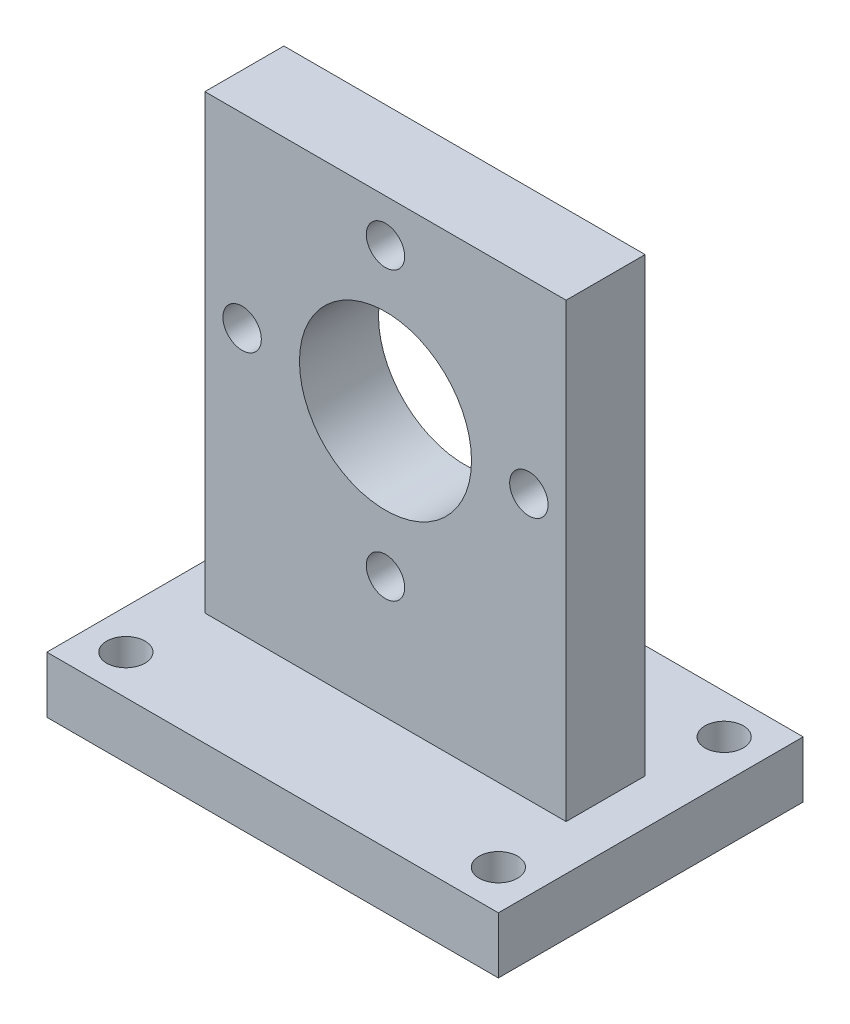
ISO-10303-21;
HEADER;
FILE_DESCRIPTION(('STEP AP214'),'2;1');
FILE_NAME('part.step','',(''),(''),'','','');
FILE_SCHEMA(('AUTOMOTIVE_DESIGN { 1 0 10303 214 1 1 1 1 }'));
ENDSEC;
DATA;
#1=APPLICATION_CONTEXT('core data for automotive mechanical design processes');
#2=APPLICATION_PROTOCOL_DEFINITION('international standard','automotive_design',2000,#1);
#3=PRODUCT_CONTEXT('',#1,'mechanical');
#4=PRODUCT('Part','Part','',(#3));
#5=PRODUCT_RELATED_PRODUCT_CATEGORY('part','',(#4));
#6=PRODUCT_DEFINITION_FORMATION('','',#4);
#7=PRODUCT_DEFINITION_CONTEXT('part definition',#1,'design');
#8=PRODUCT_DEFINITION('design','',#6,#7);
#9=PRODUCT_DEFINITION_SHAPE('','',#8);
#10=(LENGTH_UNIT() NAMED_UNIT(*) SI_UNIT(.MILLI.,.METRE.));
#11=(NAMED_UNIT(*) PLANE_ANGLE_UNIT() SI_UNIT($,.RADIAN.));
#12=(NAMED_UNIT(*) SI_UNIT($,.STERADIAN.) SOLID_ANGLE_UNIT());
#13=UNCERTAINTY_MEASURE_WITH_UNIT(LENGTH_MEASURE(1.E-05),#10,'distance_accuracy_value','');
#14=(GEOMETRIC_REPRESENTATION_CONTEXT(3) GLOBAL_UNCERTAINTY_ASSIGNED_CONTEXT((#13)) GLOBAL_UNIT_ASSIGNED_CONTEXT((#10,
#11,#12)) REPRESENTATION_CONTEXT('',''));
#15=CARTESIAN_POINT('',(0.,0.,0.));
#16=DIRECTION('',(0.,0.,1.));
#17=DIRECTION('',(1.,0.,0.));
#18=AXIS2_PLACEMENT_3D('',#15,#16,#17);
#19=CARTESIAN_POINT('',(-20.,5.,13.5));
#20=DIRECTION('',(0.,0.,-1.));
#21=DIRECTION('',(-1.,0.,0.));
#22=AXIS2_PLACEMENT_3D('',#19,#20,#21);
#23=PLANE('',#22);
#24=DIRECTION('',(1.,0.,0.));
#25=VECTOR('',#24,1.);
#26=CARTESIAN_POINT('',(-20.,0.,13.5));
#27=LINE('',#26,#25);
#28=CARTESIAN_POINT('',(-20.,0.,13.5));
#29=VERTEX_POINT('',#28);
#30=CARTESIAN_POINT('',(20.,0.,13.5));
#31=VERTEX_POINT('',#30);
#32=EDGE_CURVE('E175',#29,#31,#27,.T.);
#33=ORIENTED_EDGE('',*,*,#32,.T.);
#34=DIRECTION('',(0.,-1.,0.));
#35=VECTOR('',#34,1.);
#36=CARTESIAN_POINT('',(20.,5.,13.5));
#37=LINE('',#36,#35);
#38=CARTESIAN_POINT('',(20.,5.,13.5));
#39=VERTEX_POINT('',#38);
#40=EDGE_CURVE('E12',#39,#31,#37,.T.);
#41=ORIENTED_EDGE('',*,*,#40,.F.);
#42=DIRECTION('',(1.,0.,0.));
#43=VECTOR('',#42,1.);
#44=CARTESIAN_POINT('',(-20.,5.,13.5));
#45=LINE('',#44,#43);
#46=CARTESIAN_POINT('',(-20.,5.,13.5));
#47=VERTEX_POINT('',#46);
#48=EDGE_CURVE('E109',#47,#39,#45,.T.);
#49=ORIENTED_EDGE('',*,*,#48,.F.);
#50=DIRECTION('',(0.,-1.,0.));
#51=VECTOR('',#50,1.);
#52=CARTESIAN_POINT('',(-20.,5.,13.5));
#53=LINE('',#52,#51);
#54=EDGE_CURVE('E184',#47,#29,#53,.T.);
#55=ORIENTED_EDGE('',*,*,#54,.T.);
#56=EDGE_LOOP('',(#33,#41,#49,#55));
#57=FACE_BOUND('',#56,.T.);
#58=ADVANCED_FACE('F61',(#57),#23,.F.);
#59=CARTESIAN_POINT('',(20.,5.,-13.5));
#60=DIRECTION('',(1.,0.,0.));
#61=DIRECTION('',(0.,0.,-1.));
#62=AXIS2_PLACEMENT_3D('',#59,#60,#61);
#63=PLANE('',#62);
#64=DIRECTION('',(0.,0.,1.));
#65=VECTOR('',#64,1.);
#66=CARTESIAN_POINT('',(20.,0.,-13.5));
#67=LINE('',#66,#65);
#68=CARTESIAN_POINT('',(20.,0.,-13.5));
#69=VERTEX_POINT('',#68);
#70=EDGE_CURVE('E187',#69,#31,#67,.T.);
#71=ORIENTED_EDGE('',*,*,#70,.F.);
#72=DIRECTION('',(0.,-1.,0.));
#73=VECTOR('',#72,1.);
#74=CARTESIAN_POINT('',(20.,5.,-13.5));
#75=LINE('',#74,#73);
#76=CARTESIAN_POINT('',(20.,5.,-13.5));
#77=VERTEX_POINT('',#76);
#78=EDGE_CURVE('E68',#77,#69,#75,.T.);
#79=ORIENTED_EDGE('',*,*,#78,.F.);
#80=DIRECTION('',(0.,0.,1.));
#81=VECTOR('',#80,1.);
#82=CARTESIAN_POINT('',(20.,5.,-13.5));
#83=LINE('',#82,#81);
#84=EDGE_CURVE('E177',#77,#39,#83,.T.);
#85=ORIENTED_EDGE('',*,*,#84,.T.);
#86=ORIENTED_EDGE('',*,*,#40,.T.);
#87=EDGE_LOOP('',(#71,#79,#85,#86));
#88=FACE_BOUND('',#87,.T.);
#89=ADVANCED_FACE('F201',(#88),#63,.T.);
#90=CARTESIAN_POINT('',(-20.,5.,-13.5));
#91=DIRECTION('',(0.,0.,-1.));
#92=DIRECTION('',(-1.,0.,0.));
#93=AXIS2_PLACEMENT_3D('',#90,#91,#92);
#94=PLANE('',#93);
#95=DIRECTION('',(1.,0.,0.));
#96=VECTOR('',#95,1.);
#97=CARTESIAN_POINT('',(-20.,0.,-13.5));
#98=LINE('',#97,#96);
#99=CARTESIAN_POINT('',(-20.,0.,-13.5));
#100=VERTEX_POINT('',#99);
#101=EDGE_CURVE('E190',#100,#69,#98,.T.);
#102=ORIENTED_EDGE('',*,*,#101,.F.);
#103=DIRECTION('',(0.,-1.,0.));
#104=VECTOR('',#103,1.);
#105=CARTESIAN_POINT('',(-20.,5.,-13.5));
#106=LINE('',#105,#104);
#107=CARTESIAN_POINT('',(-20.,5.,-13.5));
#108=VERTEX_POINT('',#107);
#109=EDGE_CURVE('E195',#108,#100,#106,.T.);
#110=ORIENTED_EDGE('',*,*,#109,.F.);
#111=DIRECTION('',(1.,0.,0.));
#112=VECTOR('',#111,1.);
#113=CARTESIAN_POINT('',(-20.,5.,-13.5));
#114=LINE('',#113,#112);
#115=EDGE_CURVE('E180',#108,#77,#114,.T.);
#116=ORIENTED_EDGE('',*,*,#115,.T.);
#117=ORIENTED_EDGE('',*,*,#78,.T.);
#118=EDGE_LOOP('',(#102,#110,#116,#117));
#119=FACE_BOUND('',#118,.T.);
#120=ADVANCED_FACE('F199',(#119),#94,.T.);
#121=CARTESIAN_POINT('',(-20.,5.,-13.5));
#122=DIRECTION('',(1.,0.,0.));
#123=DIRECTION('',(0.,0.,-1.));
#124=AXIS2_PLACEMENT_3D('',#121,#122,#123);
#125=PLANE('',#124);
#126=DIRECTION('',(0.,0.,1.));
#127=VECTOR('',#126,1.);
#128=CARTESIAN_POINT('',(-20.,0.,-13.5));
#129=LINE('',#128,#127);
#130=EDGE_CURVE('E104',#100,#29,#129,.T.);
#131=ORIENTED_EDGE('',*,*,#130,.T.);
#132=ORIENTED_EDGE('',*,*,#54,.F.);
#133=DIRECTION('',(0.,0.,1.));
#134=VECTOR('',#133,1.);
#135=CARTESIAN_POINT('',(-20.,5.,-13.5));
#136=LINE('',#135,#134);
#137=EDGE_CURVE('E84',#108,#47,#136,.T.);
#138=ORIENTED_EDGE('',*,*,#137,.F.);
#139=ORIENTED_EDGE('',*,*,#109,.T.);
#140=EDGE_LOOP('',(#131,#132,#138,#139));
#141=FACE_BOUND('',#140,.T.);
#142=ADVANCED_FACE('F206',(#141),#125,.F.);
#143=CARTESIAN_POINT('',(0.,5.,0.));
#144=DIRECTION('',(0.,-1.,0.));
#145=DIRECTION('',(0.,0.,-1.));
#146=AXIS2_PLACEMENT_3D('',#143,#144,#145);
#147=PLANE('',#146);
#148=CARTESIAN_POINT('',(16.5,5.,-10.));
#149=DIRECTION('',(0.,1.,0.));
#150=DIRECTION('',(0.,0.,-1.));
#151=AXIS2_PLACEMENT_3D('',#148,#149,#150);
#152=CIRCLE('',#151,1.7);
#153=CARTESIAN_POINT('',(16.5,5.,-11.7));
#154=VERTEX_POINT('',#153);
#155=EDGE_CURVE('E441',#154,#154,#152,.T.);
#156=ORIENTED_EDGE('',*,*,#155,.F.);
#157=EDGE_LOOP('',(#156));
#158=FACE_BOUND('',#157,.T.);
#159=CARTESIAN_POINT('',(16.5,5.,10.));
#160=DIRECTION('',(0.,1.,0.));
#161=DIRECTION('',(0.,0.,-1.));
#162=AXIS2_PLACEMENT_3D('',#159,#160,#161);
#163=CIRCLE('',#162,1.7);
#164=CARTESIAN_POINT('',(16.5,5.,8.3));
#165=VERTEX_POINT('',#164);
#166=EDGE_CURVE('E443',#165,#165,#163,.T.);
#167=ORIENTED_EDGE('',*,*,#166,.F.);
#168=EDGE_LOOP('',(#167));
#169=FACE_BOUND('',#168,.T.);
#170=CARTESIAN_POINT('',(-16.5,5.,10.));
#171=DIRECTION('',(0.,1.,0.));
#172=DIRECTION('',(0.,0.,1.));
#173=AXIS2_PLACEMENT_3D('',#170,#171,#172);
#174=CIRCLE('',#173,1.7);
#175=CARTESIAN_POINT('',(-16.5,5.,11.7));
#176=VERTEX_POINT('',#175);
#177=EDGE_CURVE('E509',#176,#176,#174,.T.);
#178=ORIENTED_EDGE('',*,*,#177,.F.);
#179=EDGE_LOOP('',(#178));
#180=FACE_BOUND('',#179,.T.);
#181=CARTESIAN_POINT('',(-16.5,5.,-9.99999999999999));
#182=DIRECTION('',(0.,1.,0.));
#183=DIRECTION('',(0.,0.,1.));
#184=AXIS2_PLACEMENT_3D('',#181,#182,#183);
#185=CIRCLE('',#184,1.7);
#186=CARTESIAN_POINT('',(-16.5,5.,-8.3));
#187=VERTEX_POINT('',#186);
#188=EDGE_CURVE('E447',#187,#187,#185,.T.);
#189=ORIENTED_EDGE('',*,*,#188,.F.);
#190=EDGE_LOOP('',(#189));
#191=FACE_BOUND('',#190,.T.);
#192=DIRECTION('',(1.,0.,0.));
#193=VECTOR('',#192,1.);
#194=CARTESIAN_POINT('',(0.,5.,-3.5));
#195=LINE('',#194,#193);
#196=CARTESIAN_POINT('',(-16.,5.,-3.5));
#197=VERTEX_POINT('',#196);
#198=CARTESIAN_POINT('',(16.,5.,-3.5));
#199=VERTEX_POINT('',#198);
#200=EDGE_CURVE('E170',#197,#199,#195,.T.);
#201=ORIENTED_EDGE('',*,*,#200,.T.);
#202=DIRECTION('',(0.,0.,1.));
#203=VECTOR('',#202,1.);
#204=CARTESIAN_POINT('',(16.,5.,0.));
#205=LINE('',#204,#203);
#206=CARTESIAN_POINT('',(16.,5.00000000000001,3.5));
#207=VERTEX_POINT('',#206);
#208=EDGE_CURVE('E139',#199,#207,#205,.T.);
#209=ORIENTED_EDGE('',*,*,#208,.T.);
#210=DIRECTION('',(1.,0.,0.));
#211=VECTOR('',#210,1.);
#212=CARTESIAN_POINT('',(0.,5.,3.5));
#213=LINE('',#212,#211);
#214=CARTESIAN_POINT('',(-16.,5.,3.5));
#215=VERTEX_POINT('',#214);
#216=EDGE_CURVE('E75',#215,#207,#213,.T.);
#217=ORIENTED_EDGE('',*,*,#216,.F.);
#218=DIRECTION('',(0.,0.,1.));
#219=VECTOR('',#218,1.);
#220=CARTESIAN_POINT('',(-16.,5.,0.));
#221=LINE('',#220,#219);
#222=EDGE_CURVE('E172',#197,#215,#221,.T.);
#223=ORIENTED_EDGE('',*,*,#222,.F.);
#224=EDGE_LOOP('',(#201,#209,#217,#223));
#225=FACE_BOUND('',#224,.T.);
#226=ORIENTED_EDGE('',*,*,#48,.T.);
#227=ORIENTED_EDGE('',*,*,#84,.F.);
#228=ORIENTED_EDGE('',*,*,#115,.F.);
#229=ORIENTED_EDGE('',*,*,#137,.T.);
#230=EDGE_LOOP('',(#226,#227,#228,#229));
#231=FACE_BOUND('',#230,.T.);
#232=ADVANCED_FACE('F207',(#158,#169,#180,#191,#225,#231),#147,.F.);
#233=CARTESIAN_POINT('',(0.,0.,0.));
#234=DIRECTION('',(0.,-1.,0.));
#235=DIRECTION('',(0.,0.,-1.));
#236=AXIS2_PLACEMENT_3D('',#233,#234,#235);
#237=PLANE('',#236);
#238=CARTESIAN_POINT('',(16.5,0.,-10.));
#239=DIRECTION('',(0.,-1.,0.));
#240=DIRECTION('',(0.,0.,-1.));
#241=AXIS2_PLACEMENT_3D('',#238,#239,#240);
#242=CIRCLE('',#241,1.7);
#243=CARTESIAN_POINT('',(16.5,0.,-11.7));
#244=VERTEX_POINT('',#243);
#245=EDGE_CURVE('E439',#244,#244,#242,.F.);
#246=ORIENTED_EDGE('',*,*,#245,.T.);
#247=EDGE_LOOP('',(#246));
#248=FACE_BOUND('',#247,.T.);
#249=CARTESIAN_POINT('',(16.5,0.,10.));
#250=DIRECTION('',(0.,-1.,0.));
#251=DIRECTION('',(0.,0.,-1.));
#252=AXIS2_PLACEMENT_3D('',#249,#250,#251);
#253=CIRCLE('',#252,1.7);
#254=CARTESIAN_POINT('',(16.5,0.,8.3));
#255=VERTEX_POINT('',#254);
#256=EDGE_CURVE('E514',#255,#255,#253,.F.);
#257=ORIENTED_EDGE('',*,*,#256,.T.);
#258=EDGE_LOOP('',(#257));
#259=FACE_BOUND('',#258,.T.);
#260=CARTESIAN_POINT('',(-16.5,0.,10.));
#261=DIRECTION('',(0.,-1.,0.));
#262=DIRECTION('',(0.,0.,-1.));
#263=AXIS2_PLACEMENT_3D('',#260,#261,#262);
#264=CIRCLE('',#263,1.7);
#265=CARTESIAN_POINT('',(-16.5,0.,8.30000000000001));
#266=VERTEX_POINT('',#265);
#267=EDGE_CURVE('E454',#266,#266,#264,.F.);
#268=ORIENTED_EDGE('',*,*,#267,.T.);
#269=EDGE_LOOP('',(#268));
#270=FACE_BOUND('',#269,.T.);
#271=CARTESIAN_POINT('',(-16.5,0.,-9.99999999999999));
#272=DIRECTION('',(0.,-1.,0.));
#273=DIRECTION('',(0.,0.,-1.));
#274=AXIS2_PLACEMENT_3D('',#271,#272,#273);
#275=CIRCLE('',#274,1.7);
#276=CARTESIAN_POINT('',(-16.5,0.,-11.7));
#277=VERTEX_POINT('',#276);
#278=EDGE_CURVE('E451',#277,#277,#275,.F.);
#279=ORIENTED_EDGE('',*,*,#278,.T.);
#280=EDGE_LOOP('',(#279));
#281=FACE_BOUND('',#280,.T.);
#282=ORIENTED_EDGE('',*,*,#32,.F.);
#283=ORIENTED_EDGE('',*,*,#130,.F.);
#284=ORIENTED_EDGE('',*,*,#101,.T.);
#285=ORIENTED_EDGE('',*,*,#70,.T.);
#286=EDGE_LOOP('',(#282,#283,#284,#285));
#287=FACE_BOUND('',#286,.T.);
#288=ADVANCED_FACE('F204',(#248,#259,#270,#281,#287),#237,.T.);
#289=CARTESIAN_POINT('',(0.,45.,-3.5));
#290=DIRECTION('',(0.,0.,-1.));
#291=DIRECTION('',(-1.,0.,0.));
#292=AXIS2_PLACEMENT_3D('',#289,#290,#291);
#293=PLANE('',#292);
#294=CARTESIAN_POINT('',(0.,41.2,-3.5));
#295=DIRECTION('',(0.,0.,-1.));
#296=DIRECTION('',(-1.,0.,0.));
#297=AXIS2_PLACEMENT_3D('',#294,#295,#296);
#298=CIRCLE('',#297,1.7);
#299=CARTESIAN_POINT('',(-1.7,41.2,-3.5));
#300=VERTEX_POINT('',#299);
#301=EDGE_CURVE('E459',#300,#300,#298,.F.);
#302=ORIENTED_EDGE('',*,*,#301,.T.);
#303=EDGE_LOOP('',(#302));
#304=FACE_BOUND('',#303,.T.);
#305=CARTESIAN_POINT('',(12.7000000000002,28.5000000000001,-3.5));
#306=DIRECTION('',(0.,0.,-1.));
#307=DIRECTION('',(-1.,0.,0.));
#308=AXIS2_PLACEMENT_3D('',#305,#306,#307);
#309=CIRCLE('',#308,1.7);
#310=CARTESIAN_POINT('',(11.0000000000002,28.5000000000001,-3.5));
#311=VERTEX_POINT('',#310);
#312=EDGE_CURVE('E462',#311,#311,#309,.F.);
#313=ORIENTED_EDGE('',*,*,#312,.T.);
#314=EDGE_LOOP('',(#313));
#315=FACE_BOUND('',#314,.T.);
#316=CARTESIAN_POINT('',(2.66516243803523E-13,15.8,-3.5));
#317=DIRECTION('',(0.,0.,-1.));
#318=DIRECTION('',(-1.,0.,0.));
#319=AXIS2_PLACEMENT_3D('',#316,#317,#318);
#320=CIRCLE('',#319,1.7);
#321=CARTESIAN_POINT('',(-1.69999999999973,15.8,-3.5));
#322=VERTEX_POINT('',#321);
#323=EDGE_CURVE('E468',#322,#322,#320,.F.);
#324=ORIENTED_EDGE('',*,*,#323,.T.);
#325=EDGE_LOOP('',(#324));
#326=FACE_BOUND('',#325,.T.);
#327=CARTESIAN_POINT('',(-12.6999999999998,28.5,-3.5));
#328=DIRECTION('',(0.,0.,-1.));
#329=DIRECTION('',(-1.,0.,0.));
#330=AXIS2_PLACEMENT_3D('',#327,#328,#329);
#331=CIRCLE('',#330,1.7);
#332=CARTESIAN_POINT('',(-14.3999999999998,28.5,-3.5));
#333=VERTEX_POINT('',#332);
#334=EDGE_CURVE('E474',#333,#333,#331,.F.);
#335=ORIENTED_EDGE('',*,*,#334,.T.);
#336=EDGE_LOOP('',(#335));
#337=FACE_BOUND('',#336,.T.);
#338=CARTESIAN_POINT('',(0.,28.5,-3.5));
#339=DIRECTION('',(0.,0.,-1.));
#340=DIRECTION('',(-1.,0.,0.));
#341=AXIS2_PLACEMENT_3D('',#338,#339,#340);
#342=CIRCLE('',#341,7.62);
#343=CARTESIAN_POINT('',(-7.62,28.5,-3.5));
#344=VERTEX_POINT('',#343);
#345=EDGE_CURVE('E458',#344,#344,#342,.F.);
#346=ORIENTED_EDGE('',*,*,#345,.T.);
#347=EDGE_LOOP('',(#346));
#348=FACE_BOUND('',#347,.T.);
#349=ORIENTED_EDGE('',*,*,#200,.F.);
#350=DIRECTION('',(0.,-1.,0.));
#351=VECTOR('',#350,1.);
#352=CARTESIAN_POINT('',(-16.,45.,-3.5));
#353=LINE('',#352,#351);
#354=CARTESIAN_POINT('',(-16.,45.,-3.5));
#355=VERTEX_POINT('',#354);
#356=EDGE_CURVE('E143',#355,#197,#353,.T.);
#357=ORIENTED_EDGE('',*,*,#356,.F.);
#358=DIRECTION('',(1.,0.,0.));
#359=VECTOR('',#358,1.);
#360=CARTESIAN_POINT('',(0.,45.,-3.5));
#361=LINE('',#360,#359);
#362=CARTESIAN_POINT('',(16.,45.,-3.5));
#363=VERTEX_POINT('',#362);
#364=EDGE_CURVE('E148',#355,#363,#361,.T.);
#365=ORIENTED_EDGE('',*,*,#364,.T.);
#366=DIRECTION('',(0.,-1.,0.));
#367=VECTOR('',#366,1.);
#368=CARTESIAN_POINT('',(16.,45.,-3.5));
#369=LINE('',#368,#367);
#370=EDGE_CURVE('E134',#363,#199,#369,.T.);
#371=ORIENTED_EDGE('',*,*,#370,.T.);
#372=EDGE_LOOP('',(#349,#357,#365,#371));
#373=FACE_BOUND('',#372,.T.);
#374=ADVANCED_FACE('F154',(#304,#315,#326,#337,#348,#373),#293,.T.);
#375=CARTESIAN_POINT('',(0.,45.,3.5));
#376=DIRECTION('',(0.,0.,-1.));
#377=DIRECTION('',(-1.,0.,0.));
#378=AXIS2_PLACEMENT_3D('',#375,#376,#377);
#379=PLANE('',#378);
#380=CARTESIAN_POINT('',(0.,41.2,3.5));
#381=DIRECTION('',(0.,0.,1.));
#382=DIRECTION('',(1.,0.,0.));
#383=AXIS2_PLACEMENT_3D('',#380,#381,#382);
#384=CIRCLE('',#383,1.7);
#385=CARTESIAN_POINT('',(1.7,41.2,3.5));
#386=VERTEX_POINT('',#385);
#387=EDGE_CURVE('E455',#386,#386,#384,.T.);
#388=ORIENTED_EDGE('',*,*,#387,.F.);
#389=EDGE_LOOP('',(#388));
#390=FACE_BOUND('',#389,.T.);
#391=CARTESIAN_POINT('',(12.7000000000002,28.5000000000001,3.5));
#392=DIRECTION('',(0.,0.,1.));
#393=DIRECTION('',(1.,0.,0.));
#394=AXIS2_PLACEMENT_3D('',#391,#392,#393);
#395=CIRCLE('',#394,1.7);
#396=CARTESIAN_POINT('',(14.4000000000002,28.5000000000001,3.5));
#397=VERTEX_POINT('',#396);
#398=EDGE_CURVE('E465',#397,#397,#395,.T.);
#399=ORIENTED_EDGE('',*,*,#398,.F.);
#400=EDGE_LOOP('',(#399));
#401=FACE_BOUND('',#400,.T.);
#402=CARTESIAN_POINT('',(2.66516243803523E-13,15.8,3.5));
#403=DIRECTION('',(0.,0.,1.));
#404=DIRECTION('',(1.,0.,0.));
#405=AXIS2_PLACEMENT_3D('',#402,#403,#404);
#406=CIRCLE('',#405,1.7);
#407=CARTESIAN_POINT('',(1.70000000000027,15.8,3.5));
#408=VERTEX_POINT('',#407);
#409=EDGE_CURVE('E471',#408,#408,#406,.T.);
#410=ORIENTED_EDGE('',*,*,#409,.F.);
#411=EDGE_LOOP('',(#410));
#412=FACE_BOUND('',#411,.T.);
#413=CARTESIAN_POINT('',(-12.6999999999998,28.5,3.5));
#414=DIRECTION('',(0.,0.,1.));
#415=DIRECTION('',(1.,0.,0.));
#416=AXIS2_PLACEMENT_3D('',#413,#414,#415);
#417=CIRCLE('',#416,1.7);
#418=CARTESIAN_POINT('',(-10.9999999999998,28.5,3.5));
#419=VERTEX_POINT('',#418);
#420=EDGE_CURVE('E450',#419,#419,#417,.T.);
#421=ORIENTED_EDGE('',*,*,#420,.F.);
#422=EDGE_LOOP('',(#421));
#423=FACE_BOUND('',#422,.T.);
#424=CARTESIAN_POINT('',(0.,28.5,3.5));
#425=DIRECTION('',(0.,0.,1.));
#426=DIRECTION('',(1.,0.,0.));
#427=AXIS2_PLACEMENT_3D('',#424,#425,#426);
#428=CIRCLE('',#427,7.62);
#429=CARTESIAN_POINT('',(7.62,28.5,3.5));
#430=VERTEX_POINT('',#429);
#431=EDGE_CURVE('E152',#430,#430,#428,.T.);
#432=ORIENTED_EDGE('',*,*,#431,.F.);
#433=EDGE_LOOP('',(#432));
#434=FACE_BOUND('',#433,.T.);
#435=DIRECTION('',(0.,-1.,0.));
#436=VECTOR('',#435,1.);
#437=CARTESIAN_POINT('',(-16.,45.,3.5));
#438=LINE('',#437,#436);
#439=CARTESIAN_POINT('',(-16.,45.,3.5));
#440=VERTEX_POINT('',#439);
#441=EDGE_CURVE('E165',#440,#215,#438,.T.);
#442=ORIENTED_EDGE('',*,*,#441,.T.);
#443=ORIENTED_EDGE('',*,*,#216,.T.);
#444=DIRECTION('',(0.,-1.,0.));
#445=VECTOR('',#444,1.);
#446=CARTESIAN_POINT('',(16.,45.,3.5));
#447=LINE('',#446,#445);
#448=CARTESIAN_POINT('',(16.,45.,3.5));
#449=VERTEX_POINT('',#448);
#450=EDGE_CURVE('E163',#449,#207,#447,.T.);
#451=ORIENTED_EDGE('',*,*,#450,.F.);
#452=DIRECTION('',(1.,0.,0.));
#453=VECTOR('',#452,1.);
#454=CARTESIAN_POINT('',(0.,45.,3.5));
#455=LINE('',#454,#453);
#456=EDGE_CURVE('E150',#440,#449,#455,.T.);
#457=ORIENTED_EDGE('',*,*,#456,.F.);
#458=EDGE_LOOP('',(#442,#443,#451,#457));
#459=FACE_BOUND('',#458,.T.);
#460=ADVANCED_FACE('F247',(#390,#401,#412,#423,#434,#459),#379,.F.);
#461=CARTESIAN_POINT('',(16.,45.,0.));
#462=DIRECTION('',(1.,0.,0.));
#463=DIRECTION('',(0.,0.,-1.));
#464=AXIS2_PLACEMENT_3D('',#461,#462,#463);
#465=PLANE('',#464);
#466=ORIENTED_EDGE('',*,*,#208,.F.);
#467=ORIENTED_EDGE('',*,*,#370,.F.);
#468=DIRECTION('',(0.,0.,1.));
#469=VECTOR('',#468,1.);
#470=CARTESIAN_POINT('',(16.,45.,0.));
#471=LINE('',#470,#469);
#472=EDGE_CURVE('E138',#363,#449,#471,.T.);
#473=ORIENTED_EDGE('',*,*,#472,.T.);
#474=ORIENTED_EDGE('',*,*,#450,.T.);
#475=EDGE_LOOP('',(#466,#467,#473,#474));
#476=FACE_BOUND('',#475,.T.);
#477=ADVANCED_FACE('F136',(#476),#465,.T.);
#478=CARTESIAN_POINT('',(-16.,45.,0.));
#479=DIRECTION('',(1.,0.,0.));
#480=DIRECTION('',(0.,0.,-1.));
#481=AXIS2_PLACEMENT_3D('',#478,#479,#480);
#482=PLANE('',#481);
#483=ORIENTED_EDGE('',*,*,#356,.T.);
#484=ORIENTED_EDGE('',*,*,#222,.T.);
#485=ORIENTED_EDGE('',*,*,#441,.F.);
#486=DIRECTION('',(0.,0.,1.));
#487=VECTOR('',#486,1.);
#488=CARTESIAN_POINT('',(-16.,45.,0.));
#489=LINE('',#488,#487);
#490=EDGE_CURVE('E157',#355,#440,#489,.T.);
#491=ORIENTED_EDGE('',*,*,#490,.F.);
#492=EDGE_LOOP('',(#483,#484,#485,#491));
#493=FACE_BOUND('',#492,.T.);
#494=ADVANCED_FACE('F246',(#493),#482,.F.);
#495=CARTESIAN_POINT('',(0.,45.,0.));
#496=DIRECTION('',(0.,1.,0.));
#497=DIRECTION('',(0.,0.,1.));
#498=AXIS2_PLACEMENT_3D('',#495,#496,#497);
#499=PLANE('',#498);
#500=ORIENTED_EDGE('',*,*,#472,.F.);
#501=ORIENTED_EDGE('',*,*,#364,.F.);
#502=ORIENTED_EDGE('',*,*,#490,.T.);
#503=ORIENTED_EDGE('',*,*,#456,.T.);
#504=EDGE_LOOP('',(#500,#501,#502,#503));
#505=FACE_BOUND('',#504,.T.);
#506=ADVANCED_FACE('F147',(#505),#499,.T.);
#507=CARTESIAN_POINT('',(0.,28.5,-13.501));
#508=DIRECTION('',(0.,0.,1.));
#509=DIRECTION('',(1.,0.,0.));
#510=AXIS2_PLACEMENT_3D('',#507,#508,#509);
#511=CYLINDRICAL_SURFACE('',#510,7.62);
#512=ORIENTED_EDGE('',*,*,#345,.F.);
#513=EDGE_LOOP('',(#512));
#514=FACE_BOUND('',#513,.T.);
#515=ORIENTED_EDGE('',*,*,#431,.T.);
#516=EDGE_LOOP('',(#515));
#517=FACE_BOUND('',#516,.T.);
#518=ADVANCED_FACE('F268',(#514,#517),#511,.F.);
#519=CARTESIAN_POINT('',(-12.6999999999998,28.5,-13.501));
#520=DIRECTION('',(0.,0.,1.));
#521=DIRECTION('',(1.,0.,0.));
#522=AXIS2_PLACEMENT_3D('',#519,#520,#521);
#523=CYLINDRICAL_SURFACE('',#522,1.7);
#524=ORIENTED_EDGE('',*,*,#334,.F.);
#525=EDGE_LOOP('',(#524));
#526=FACE_BOUND('',#525,.T.);
#527=ORIENTED_EDGE('',*,*,#420,.T.);
#528=EDGE_LOOP('',(#527));
#529=FACE_BOUND('',#528,.T.);
#530=ADVANCED_FACE('F278',(#526,#529),#523,.F.);
#531=CARTESIAN_POINT('',(2.66516243803523E-13,15.8,-13.501));
#532=DIRECTION('',(0.,0.,1.));
#533=DIRECTION('',(1.,0.,0.));
#534=AXIS2_PLACEMENT_3D('',#531,#532,#533);
#535=CYLINDRICAL_SURFACE('',#534,1.7);
#536=ORIENTED_EDGE('',*,*,#323,.F.);
#537=EDGE_LOOP('',(#536));
#538=FACE_BOUND('',#537,.T.);
#539=ORIENTED_EDGE('',*,*,#409,.T.);
#540=EDGE_LOOP('',(#539));
#541=FACE_BOUND('',#540,.T.);
#542=ADVANCED_FACE('F308',(#538,#541),#535,.F.);
#543=CARTESIAN_POINT('',(12.7000000000002,28.5000000000001,-13.501));
#544=DIRECTION('',(0.,0.,1.));
#545=DIRECTION('',(1.,0.,0.));
#546=AXIS2_PLACEMENT_3D('',#543,#544,#545);
#547=CYLINDRICAL_SURFACE('',#546,1.7);
#548=ORIENTED_EDGE('',*,*,#312,.F.);
#549=EDGE_LOOP('',(#548));
#550=FACE_BOUND('',#549,.T.);
#551=ORIENTED_EDGE('',*,*,#398,.T.);
#552=EDGE_LOOP('',(#551));
#553=FACE_BOUND('',#552,.T.);
#554=ADVANCED_FACE('F319',(#550,#553),#547,.F.);
#555=CARTESIAN_POINT('',(0.,41.2,-13.501));
#556=DIRECTION('',(0.,0.,1.));
#557=DIRECTION('',(1.,0.,0.));
#558=AXIS2_PLACEMENT_3D('',#555,#556,#557);
#559=CYLINDRICAL_SURFACE('',#558,1.7);
#560=ORIENTED_EDGE('',*,*,#301,.F.);
#561=EDGE_LOOP('',(#560));
#562=FACE_BOUND('',#561,.T.);
#563=ORIENTED_EDGE('',*,*,#387,.T.);
#564=EDGE_LOOP('',(#563));
#565=FACE_BOUND('',#564,.T.);
#566=ADVANCED_FACE('F330',(#562,#565),#559,.F.);
#567=CARTESIAN_POINT('',(-16.5,-0.00100000000000013,-9.99999999999999));
#568=DIRECTION('',(0.,1.,0.));
#569=DIRECTION('',(0.,0.,1.));
#570=AXIS2_PLACEMENT_3D('',#567,#568,#569);
#571=CYLINDRICAL_SURFACE('',#570,1.7);
#572=ORIENTED_EDGE('',*,*,#278,.F.);
#573=EDGE_LOOP('',(#572));
#574=FACE_BOUND('',#573,.T.);
#575=ORIENTED_EDGE('',*,*,#188,.T.);
#576=EDGE_LOOP('',(#575));
#577=FACE_BOUND('',#576,.T.);
#578=ADVANCED_FACE('F340',(#574,#577),#571,.F.);
#579=CARTESIAN_POINT('',(-16.5,-0.00100000000000013,10.));
#580=DIRECTION('',(0.,1.,0.));
#581=DIRECTION('',(0.,0.,1.));
#582=AXIS2_PLACEMENT_3D('',#579,#580,#581);
#583=CYLINDRICAL_SURFACE('',#582,1.7);
#584=ORIENTED_EDGE('',*,*,#267,.F.);
#585=EDGE_LOOP('',(#584));
#586=FACE_BOUND('',#585,.T.);
#587=ORIENTED_EDGE('',*,*,#177,.T.);
#588=EDGE_LOOP('',(#587));
#589=FACE_BOUND('',#588,.T.);
#590=ADVANCED_FACE('F362',(#586,#589),#583,.F.);
#591=CARTESIAN_POINT('',(16.5,-0.00100000000000013,10.));
#592=DIRECTION('',(0.,1.,0.));
#593=DIRECTION('',(0.,0.,1.));
#594=AXIS2_PLACEMENT_3D('',#591,#592,#593);
#595=CYLINDRICAL_SURFACE('',#594,1.7);
#596=ORIENTED_EDGE('',*,*,#256,.F.);
#597=EDGE_LOOP('',(#596));
#598=FACE_BOUND('',#597,.T.);
#599=ORIENTED_EDGE('',*,*,#166,.T.);
#600=EDGE_LOOP('',(#599));
#601=FACE_BOUND('',#600,.T.);
#602=ADVANCED_FACE('F373',(#598,#601),#595,.F.);
#603=CARTESIAN_POINT('',(16.5,-0.00100000000000013,-10.));
#604=DIRECTION('',(0.,1.,0.));
#605=DIRECTION('',(0.,0.,1.));
#606=AXIS2_PLACEMENT_3D('',#603,#604,#605);
#607=CYLINDRICAL_SURFACE('',#606,1.7);
#608=ORIENTED_EDGE('',*,*,#245,.F.);
#609=EDGE_LOOP('',(#608));
#610=FACE_BOUND('',#609,.T.);
#611=ORIENTED_EDGE('',*,*,#155,.T.);
#612=EDGE_LOOP('',(#611));
#613=FACE_BOUND('',#612,.T.);
#614=ADVANCED_FACE('F384',(#610,#613),#607,.F.);
#615=CLOSED_SHELL('',(#58,#89,#120,#142,#232,#288,#374,#460,#477,#494,#506,#518,#530,#542,#554,
#566,#578,#590,#602,#614));
#616=MANIFOLD_SOLID_BREP('B2',#615);
#617=ADVANCED_BREP_SHAPE_REPRESENTATION('',(#18,#616),#14);
#618=SHAPE_DEFINITION_REPRESENTATION(#9,#617);
ENDSEC;
END-ISO-10303-21;
